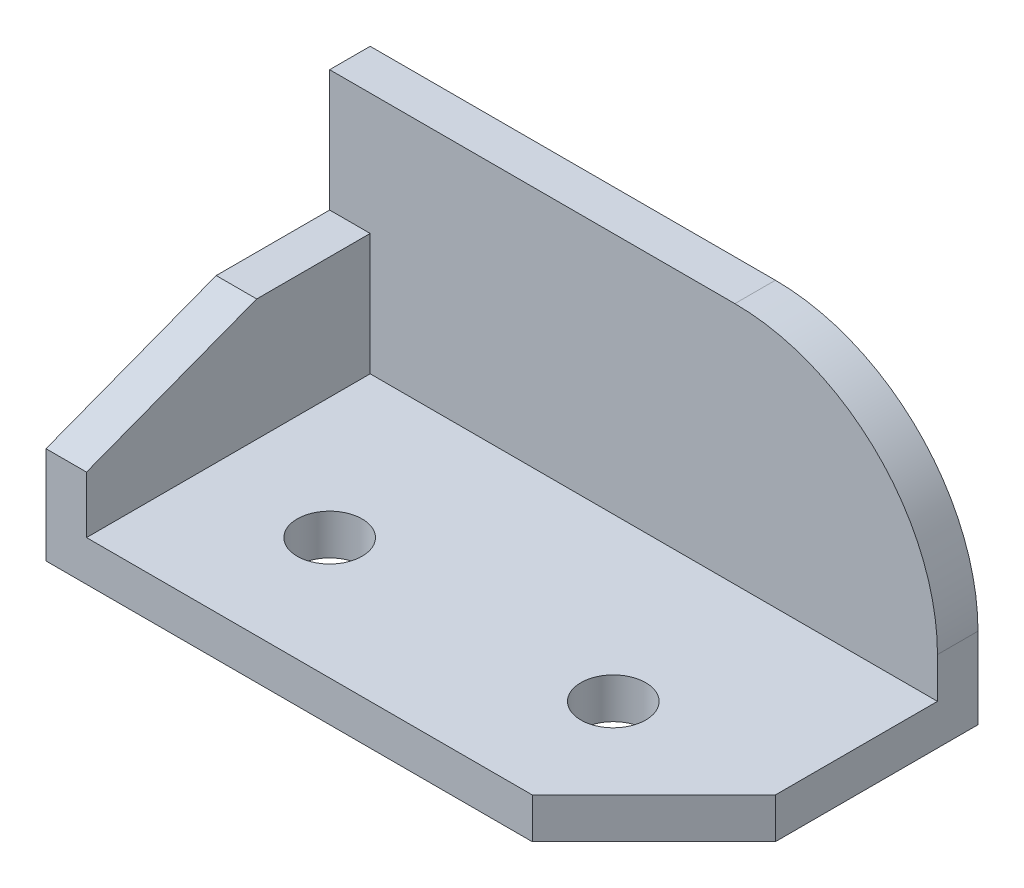
ISO-10303-21;
HEADER;
FILE_DESCRIPTION(('STEP AP214'),'2;1');
FILE_NAME('part.step','',(''),(''),'','','');
FILE_SCHEMA(('AUTOMOTIVE_DESIGN { 1 0 10303 214 1 1 1 1 }'));
ENDSEC;
DATA;
#1=APPLICATION_CONTEXT('core data for automotive mechanical design processes');
#2=APPLICATION_PROTOCOL_DEFINITION('international standard','automotive_design',2000,#1);
#3=PRODUCT_CONTEXT('',#1,'mechanical');
#4=PRODUCT('Part','Part','',(#3));
#5=PRODUCT_RELATED_PRODUCT_CATEGORY('part','',(#4));
#6=PRODUCT_DEFINITION_FORMATION('','',#4);
#7=PRODUCT_DEFINITION_CONTEXT('part definition',#1,'design');
#8=PRODUCT_DEFINITION('design','',#6,#7);
#9=PRODUCT_DEFINITION_SHAPE('','',#8);
#10=(LENGTH_UNIT() NAMED_UNIT(*) SI_UNIT(.MILLI.,.METRE.));
#11=(NAMED_UNIT(*) PLANE_ANGLE_UNIT() SI_UNIT($,.RADIAN.));
#12=(NAMED_UNIT(*) SI_UNIT($,.STERADIAN.) SOLID_ANGLE_UNIT());
#13=UNCERTAINTY_MEASURE_WITH_UNIT(LENGTH_MEASURE(1.E-05),#10,'distance_accuracy_value','');
#14=(GEOMETRIC_REPRESENTATION_CONTEXT(3) GLOBAL_UNCERTAINTY_ASSIGNED_CONTEXT((#13)) GLOBAL_UNIT_ASSIGNED_CONTEXT((#10,
#11,#12)) REPRESENTATION_CONTEXT('',''));
#15=CARTESIAN_POINT('',(0.,0.,0.));
#16=DIRECTION('',(0.,0.,1.));
#17=DIRECTION('',(1.,0.,0.));
#18=AXIS2_PLACEMENT_3D('',#15,#16,#17);
#19=CARTESIAN_POINT('',(0.,5.,40.));
#20=DIRECTION('',(0.,0.,-1.));
#21=DIRECTION('',(-1.,0.,0.));
#22=AXIS2_PLACEMENT_3D('',#19,#20,#21);
#23=PLANE('',#22);
#24=DIRECTION('',(0.,-1.,0.));
#25=VECTOR('',#24,1.);
#26=CARTESIAN_POINT('',(5.,20.,40.));
#27=LINE('',#26,#25);
#28=CARTESIAN_POINT('',(5.,12.,40.));
#29=VERTEX_POINT('',#28);
#30=CARTESIAN_POINT('',(5.,5.,40.));
#31=VERTEX_POINT('',#30);
#32=EDGE_CURVE('E147',#29,#31,#27,.T.);
#33=ORIENTED_EDGE('',*,*,#32,.F.);
#34=DIRECTION('',(-1.,0.,0.));
#35=VECTOR('',#34,1.);
#36=CARTESIAN_POINT('',(0.,12.,40.));
#37=LINE('',#36,#35);
#38=CARTESIAN_POINT('',(0.,12.,40.));
#39=VERTEX_POINT('',#38);
#40=EDGE_CURVE('E212',#29,#39,#37,.T.);
#41=ORIENTED_EDGE('',*,*,#40,.T.);
#42=DIRECTION('',(0.,-1.,0.));
#43=VECTOR('',#42,1.);
#44=CARTESIAN_POINT('',(0.,20.,40.));
#45=LINE('',#44,#43);
#46=CARTESIAN_POINT('',(0.,0.,40.));
#47=VERTEX_POINT('',#46);
#48=EDGE_CURVE('E142',#39,#47,#45,.T.);
#49=ORIENTED_EDGE('',*,*,#48,.T.);
#50=DIRECTION('',(1.,0.,0.));
#51=VECTOR('',#50,1.);
#52=CARTESIAN_POINT('',(0.,0.,40.));
#53=LINE('',#52,#51);
#54=CARTESIAN_POINT('',(60.,0.,40.));
#55=VERTEX_POINT('',#54);
#56=EDGE_CURVE('E200',#47,#55,#53,.T.);
#57=ORIENTED_EDGE('',*,*,#56,.T.);
#58=DIRECTION('',(0.,-1.,0.));
#59=VECTOR('',#58,1.);
#60=CARTESIAN_POINT('',(60.,5.,40.));
#61=LINE('',#60,#59);
#62=CARTESIAN_POINT('',(60.,5.,40.));
#63=VERTEX_POINT('',#62);
#64=EDGE_CURVE('E208',#63,#55,#61,.T.);
#65=ORIENTED_EDGE('',*,*,#64,.F.);
#66=DIRECTION('',(1.,0.,0.));
#67=VECTOR('',#66,1.);
#68=CARTESIAN_POINT('',(0.,5.,40.));
#69=LINE('',#68,#67);
#70=EDGE_CURVE('E185',#31,#63,#69,.T.);
#71=ORIENTED_EDGE('',*,*,#70,.F.);
#72=EDGE_LOOP('',(#33,#41,#49,#57,#65,#71));
#73=FACE_BOUND('',#72,.T.);
#74=ADVANCED_FACE('F41',(#73),#23,.F.);
#75=CARTESIAN_POINT('',(50.,5.,50.));
#76=DIRECTION('',(-0.707106781186548,0.,-0.707106781186548));
#77=DIRECTION('',(-0.707106781186548,0.,0.707106781186548));
#78=AXIS2_PLACEMENT_3D('',#75,#76,#77);
#79=PLANE('',#78);
#80=DIRECTION('',(0.707106781186548,0.,-0.707106781186548));
#81=VECTOR('',#80,1.);
#82=CARTESIAN_POINT('',(50.,0.,50.));
#83=LINE('',#82,#81);
#84=CARTESIAN_POINT('',(75.,0.,25.));
#85=VERTEX_POINT('',#84);
#86=EDGE_CURVE('E205',#55,#85,#83,.T.);
#87=ORIENTED_EDGE('',*,*,#86,.T.);
#88=DIRECTION('',(0.,-1.,0.));
#89=VECTOR('',#88,1.);
#90=CARTESIAN_POINT('',(75.,5.,25.));
#91=LINE('',#90,#89);
#92=CARTESIAN_POINT('',(75.,5.,25.));
#93=VERTEX_POINT('',#92);
#94=EDGE_CURVE('E195',#93,#85,#91,.T.);
#95=ORIENTED_EDGE('',*,*,#94,.F.);
#96=DIRECTION('',(0.707106781186548,0.,-0.707106781186548));
#97=VECTOR('',#96,1.);
#98=CARTESIAN_POINT('',(50.,5.,50.));
#99=LINE('',#98,#97);
#100=EDGE_CURVE('E183',#63,#93,#99,.T.);
#101=ORIENTED_EDGE('',*,*,#100,.F.);
#102=ORIENTED_EDGE('',*,*,#64,.T.);
#103=EDGE_LOOP('',(#87,#95,#101,#102));
#104=FACE_BOUND('',#103,.T.);
#105=ADVANCED_FACE('F235',(#104),#79,.F.);
#106=CARTESIAN_POINT('',(75.,5.,0.));
#107=DIRECTION('',(1.,0.,0.));
#108=DIRECTION('',(0.,0.,-1.));
#109=AXIS2_PLACEMENT_3D('',#106,#107,#108);
#110=PLANE('',#109);
#111=DIRECTION('',(0.,-1.,0.));
#112=VECTOR('',#111,1.);
#113=CARTESIAN_POINT('',(75.,35.,0.));
#114=LINE('',#113,#112);
#115=CARTESIAN_POINT('',(75.,10.,0.));
#116=VERTEX_POINT('',#115);
#117=CARTESIAN_POINT('',(75.,0.,0.));
#118=VERTEX_POINT('',#117);
#119=EDGE_CURVE('E168',#116,#118,#114,.T.);
#120=ORIENTED_EDGE('',*,*,#119,.F.);
#121=DIRECTION('',(0.,0.,1.));
#122=VECTOR('',#121,1.);
#123=CARTESIAN_POINT('',(75.,10.,0.));
#124=LINE('',#123,#122);
#125=CARTESIAN_POINT('',(75.,10.,5.));
#126=VERTEX_POINT('',#125);
#127=EDGE_CURVE('E217',#116,#126,#124,.T.);
#128=ORIENTED_EDGE('',*,*,#127,.T.);
#129=DIRECTION('',(0.,-1.,0.));
#130=VECTOR('',#129,1.);
#131=CARTESIAN_POINT('',(75.,35.,5.));
#132=LINE('',#131,#130);
#133=CARTESIAN_POINT('',(75.,5.,5.));
#134=VERTEX_POINT('',#133);
#135=EDGE_CURVE('E175',#126,#134,#132,.T.);
#136=ORIENTED_EDGE('',*,*,#135,.T.);
#137=DIRECTION('',(0.,0.,1.));
#138=VECTOR('',#137,1.);
#139=CARTESIAN_POINT('',(75.,5.,0.));
#140=LINE('',#139,#138);
#141=EDGE_CURVE('E190',#134,#93,#140,.T.);
#142=ORIENTED_EDGE('',*,*,#141,.T.);
#143=ORIENTED_EDGE('',*,*,#94,.T.);
#144=DIRECTION('',(0.,0.,1.));
#145=VECTOR('',#144,1.);
#146=CARTESIAN_POINT('',(75.,0.,0.));
#147=LINE('',#146,#145);
#148=EDGE_CURVE('E176',#118,#85,#147,.T.);
#149=ORIENTED_EDGE('',*,*,#148,.F.);
#150=EDGE_LOOP('',(#120,#128,#136,#142,#143,#149));
#151=FACE_BOUND('',#150,.T.);
#152=ADVANCED_FACE('F221',(#151),#110,.T.);
#153=CARTESIAN_POINT('',(55.,5.,25.));
#154=DIRECTION('',(0.,-1.,0.));
#155=DIRECTION('',(0.,0.,-1.));
#156=AXIS2_PLACEMENT_3D('',#153,#154,#155);
#157=CYLINDRICAL_SURFACE('',#156,4.);
#158=CARTESIAN_POINT('',(55.,5.,25.));
#159=DIRECTION('',(0.,1.,0.));
#160=DIRECTION('',(0.,0.,1.));
#161=AXIS2_PLACEMENT_3D('',#158,#159,#160);
#162=CIRCLE('',#161,4.);
#163=CARTESIAN_POINT('',(55.,5.,29.));
#164=VERTEX_POINT('',#163);
#165=EDGE_CURVE('E180',#164,#164,#162,.T.);
#166=ORIENTED_EDGE('',*,*,#165,.T.);
#167=EDGE_LOOP('',(#166));
#168=FACE_BOUND('',#167,.T.);
#169=CARTESIAN_POINT('',(55.,0.,25.));
#170=DIRECTION('',(0.,1.,0.));
#171=DIRECTION('',(0.,0.,1.));
#172=AXIS2_PLACEMENT_3D('',#169,#170,#171);
#173=CIRCLE('',#172,4.);
#174=CARTESIAN_POINT('',(55.,0.,29.));
#175=VERTEX_POINT('',#174);
#176=EDGE_CURVE('E198',#175,#175,#173,.T.);
#177=ORIENTED_EDGE('',*,*,#176,.F.);
#178=EDGE_LOOP('',(#177));
#179=FACE_BOUND('',#178,.T.);
#180=ADVANCED_FACE('F265',(#168,#179),#157,.F.);
#181=CARTESIAN_POINT('',(20.,5.,25.));
#182=DIRECTION('',(0.,-1.,0.));
#183=DIRECTION('',(0.,0.,-1.));
#184=AXIS2_PLACEMENT_3D('',#181,#182,#183);
#185=CYLINDRICAL_SURFACE('',#184,4.);
#186=CARTESIAN_POINT('',(20.,5.,25.));
#187=DIRECTION('',(0.,1.,0.));
#188=DIRECTION('',(0.,0.,1.));
#189=AXIS2_PLACEMENT_3D('',#186,#187,#188);
#190=CIRCLE('',#189,4.);
#191=CARTESIAN_POINT('',(20.,5.,29.));
#192=VERTEX_POINT('',#191);
#193=EDGE_CURVE('E173',#192,#192,#190,.T.);
#194=ORIENTED_EDGE('',*,*,#193,.T.);
#195=EDGE_LOOP('',(#194));
#196=FACE_BOUND('',#195,.T.);
#197=CARTESIAN_POINT('',(20.,0.,25.));
#198=DIRECTION('',(0.,1.,0.));
#199=DIRECTION('',(0.,0.,1.));
#200=AXIS2_PLACEMENT_3D('',#197,#198,#199);
#201=CIRCLE('',#200,4.);
#202=CARTESIAN_POINT('',(20.,0.,29.));
#203=VERTEX_POINT('',#202);
#204=EDGE_CURVE('E171',#203,#203,#201,.T.);
#205=ORIENTED_EDGE('',*,*,#204,.F.);
#206=EDGE_LOOP('',(#205));
#207=FACE_BOUND('',#206,.T.);
#208=ADVANCED_FACE('F264',(#196,#207),#185,.F.);
#209=CARTESIAN_POINT('',(0.,5.,0.));
#210=DIRECTION('',(0.,1.,0.));
#211=DIRECTION('',(0.,0.,1.));
#212=AXIS2_PLACEMENT_3D('',#209,#210,#211);
#213=PLANE('',#212);
#214=ORIENTED_EDGE('',*,*,#193,.F.);
#215=EDGE_LOOP('',(#214));
#216=FACE_BOUND('',#215,.T.);
#217=ORIENTED_EDGE('',*,*,#165,.F.);
#218=EDGE_LOOP('',(#217));
#219=FACE_BOUND('',#218,.T.);
#220=ORIENTED_EDGE('',*,*,#70,.T.);
#221=ORIENTED_EDGE('',*,*,#100,.T.);
#222=ORIENTED_EDGE('',*,*,#141,.F.);
#223=DIRECTION('',(-1.,0.,0.));
#224=VECTOR('',#223,1.);
#225=CARTESIAN_POINT('',(0.,5.,5.00000000000001));
#226=LINE('',#225,#224);
#227=CARTESIAN_POINT('',(5.,5.,5.00000000000001));
#228=VERTEX_POINT('',#227);
#229=EDGE_CURVE('E188',#134,#228,#226,.T.);
#230=ORIENTED_EDGE('',*,*,#229,.T.);
#231=DIRECTION('',(0.,0.,-1.));
#232=VECTOR('',#231,1.);
#233=CARTESIAN_POINT('',(5.00000000000001,5.,0.));
#234=LINE('',#233,#232);
#235=EDGE_CURVE('E140',#31,#228,#234,.T.);
#236=ORIENTED_EDGE('',*,*,#235,.F.);
#237=EDGE_LOOP('',(#220,#221,#222,#230,#236));
#238=FACE_BOUND('',#237,.T.);
#239=ADVANCED_FACE('F228',(#216,#219,#238),#213,.T.);
#240=CARTESIAN_POINT('',(0.,0.,0.));
#241=DIRECTION('',(0.,1.,0.));
#242=DIRECTION('',(0.,0.,1.));
#243=AXIS2_PLACEMENT_3D('',#240,#241,#242);
#244=PLANE('',#243);
#245=ORIENTED_EDGE('',*,*,#204,.T.);
#246=EDGE_LOOP('',(#245));
#247=FACE_BOUND('',#246,.T.);
#248=ORIENTED_EDGE('',*,*,#176,.T.);
#249=EDGE_LOOP('',(#248));
#250=FACE_BOUND('',#249,.T.);
#251=ORIENTED_EDGE('',*,*,#56,.F.);
#252=DIRECTION('',(0.,0.,1.));
#253=VECTOR('',#252,1.);
#254=CARTESIAN_POINT('',(0.,0.,0.));
#255=LINE('',#254,#253);
#256=CARTESIAN_POINT('',(0.,0.,0.));
#257=VERTEX_POINT('',#256);
#258=EDGE_CURVE('E158',#257,#47,#255,.T.);
#259=ORIENTED_EDGE('',*,*,#258,.F.);
#260=DIRECTION('',(1.,0.,0.));
#261=VECTOR('',#260,1.);
#262=CARTESIAN_POINT('',(0.,0.,0.));
#263=LINE('',#262,#261);
#264=EDGE_CURVE('E143',#257,#118,#263,.T.);
#265=ORIENTED_EDGE('',*,*,#264,.T.);
#266=ORIENTED_EDGE('',*,*,#148,.T.);
#267=ORIENTED_EDGE('',*,*,#86,.F.);
#268=EDGE_LOOP('',(#251,#259,#265,#266,#267));
#269=FACE_BOUND('',#268,.T.);
#270=ADVANCED_FACE('F240',(#247,#250,#269),#244,.F.);
#271=CARTESIAN_POINT('',(0.,35.,5.00000000000001));
#272=DIRECTION('',(0.,0.,1.));
#273=DIRECTION('',(1.,0.,0.));
#274=AXIS2_PLACEMENT_3D('',#271,#272,#273);
#275=PLANE('',#274);
#276=ORIENTED_EDGE('',*,*,#135,.F.);
#277=CARTESIAN_POINT('',(50.,10.,5.00000000000001));
#278=DIRECTION('',(0.,0.,1.));
#279=DIRECTION('',(1.,0.,0.));
#280=AXIS2_PLACEMENT_3D('',#277,#278,#279);
#281=CIRCLE('',#280,25.);
#282=CARTESIAN_POINT('',(50.,35.,5.00000000000001));
#283=VERTEX_POINT('',#282);
#284=EDGE_CURVE('E64',#126,#283,#281,.T.);
#285=ORIENTED_EDGE('',*,*,#284,.T.);
#286=DIRECTION('',(-1.,0.,0.));
#287=VECTOR('',#286,1.);
#288=CARTESIAN_POINT('',(0.,35.,5.00000000000001));
#289=LINE('',#288,#287);
#290=CARTESIAN_POINT('',(0.,35.,5.00000000000001));
#291=VERTEX_POINT('',#290);
#292=EDGE_CURVE('E154',#283,#291,#289,.T.);
#293=ORIENTED_EDGE('',*,*,#292,.T.);
#294=DIRECTION('',(0.,-1.,0.));
#295=VECTOR('',#294,1.);
#296=CARTESIAN_POINT('',(0.,35.,5.00000000000001));
#297=LINE('',#296,#295);
#298=CARTESIAN_POINT('',(0.,20.,5.00000000000001));
#299=VERTEX_POINT('',#298);
#300=EDGE_CURVE('E150',#291,#299,#297,.T.);
#301=ORIENTED_EDGE('',*,*,#300,.T.);
#302=DIRECTION('',(-1.,0.,0.));
#303=VECTOR('',#302,1.);
#304=CARTESIAN_POINT('',(0.,20.,5.00000000000001));
#305=LINE('',#304,#303);
#306=CARTESIAN_POINT('',(5.,20.,5.00000000000001));
#307=VERTEX_POINT('',#306);
#308=EDGE_CURVE('E126',#307,#299,#305,.T.);
#309=ORIENTED_EDGE('',*,*,#308,.F.);
#310=DIRECTION('',(0.,-1.,0.));
#311=VECTOR('',#310,1.);
#312=CARTESIAN_POINT('',(5.,20.,5.00000000000001));
#313=LINE('',#312,#311);
#314=EDGE_CURVE('E133',#307,#228,#313,.T.);
#315=ORIENTED_EDGE('',*,*,#314,.T.);
#316=ORIENTED_EDGE('',*,*,#229,.F.);
#317=EDGE_LOOP('',(#276,#285,#293,#301,#309,#315,#316));
#318=FACE_BOUND('',#317,.T.);
#319=ADVANCED_FACE('F144',(#318),#275,.T.);
#320=CARTESIAN_POINT('',(0.,35.,0.));
#321=DIRECTION('',(0.,0.,-1.));
#322=DIRECTION('',(-1.,0.,0.));
#323=AXIS2_PLACEMENT_3D('',#320,#321,#322);
#324=PLANE('',#323);
#325=DIRECTION('',(1.,0.,0.));
#326=VECTOR('',#325,1.);
#327=CARTESIAN_POINT('',(0.,35.,0.));
#328=LINE('',#327,#326);
#329=CARTESIAN_POINT('',(0.,35.,0.));
#330=VERTEX_POINT('',#329);
#331=CARTESIAN_POINT('',(50.,35.,0.));
#332=VERTEX_POINT('',#331);
#333=EDGE_CURVE('E160',#330,#332,#328,.T.);
#334=ORIENTED_EDGE('',*,*,#333,.T.);
#335=CARTESIAN_POINT('',(50.,10.,0.));
#336=DIRECTION('',(0.,0.,-1.));
#337=DIRECTION('',(-1.,0.,0.));
#338=AXIS2_PLACEMENT_3D('',#335,#336,#337);
#339=CIRCLE('',#338,25.);
#340=EDGE_CURVE('E11',#332,#116,#339,.T.);
#341=ORIENTED_EDGE('',*,*,#340,.T.);
#342=ORIENTED_EDGE('',*,*,#119,.T.);
#343=ORIENTED_EDGE('',*,*,#264,.F.);
#344=DIRECTION('',(0.,-1.,0.));
#345=VECTOR('',#344,1.);
#346=CARTESIAN_POINT('',(0.,35.,0.));
#347=LINE('',#346,#345);
#348=EDGE_CURVE('E169',#330,#257,#347,.T.);
#349=ORIENTED_EDGE('',*,*,#348,.F.);
#350=EDGE_LOOP('',(#334,#341,#342,#343,#349));
#351=FACE_BOUND('',#350,.T.);
#352=ADVANCED_FACE('F242',(#351),#324,.T.);
#353=CARTESIAN_POINT('',(0.,35.,0.));
#354=DIRECTION('',(1.,0.,0.));
#355=DIRECTION('',(0.,0.,-1.));
#356=AXIS2_PLACEMENT_3D('',#353,#354,#355);
#357=PLANE('',#356);
#358=ORIENTED_EDGE('',*,*,#48,.F.);
#359=DIRECTION('',(0.,0.355995327591985,-0.934487734928969));
#360=VECTOR('',#359,1.);
#361=CARTESIAN_POINT('',(0.,20.,18.9999999999998));
#362=LINE('',#361,#360);
#363=CARTESIAN_POINT('',(0.,20.,18.9999999999998));
#364=VERTEX_POINT('',#363);
#365=EDGE_CURVE('E216',#39,#364,#362,.T.);
#366=ORIENTED_EDGE('',*,*,#365,.T.);
#367=DIRECTION('',(0.,0.,1.));
#368=VECTOR('',#367,1.);
#369=CARTESIAN_POINT('',(0.,20.,0.));
#370=LINE('',#369,#368);
#371=EDGE_CURVE('E146',#299,#364,#370,.T.);
#372=ORIENTED_EDGE('',*,*,#371,.F.);
#373=ORIENTED_EDGE('',*,*,#300,.F.);
#374=DIRECTION('',(0.,0.,1.));
#375=VECTOR('',#374,1.);
#376=CARTESIAN_POINT('',(0.,35.,0.));
#377=LINE('',#376,#375);
#378=EDGE_CURVE('E159',#330,#291,#377,.T.);
#379=ORIENTED_EDGE('',*,*,#378,.F.);
#380=ORIENTED_EDGE('',*,*,#348,.T.);
#381=ORIENTED_EDGE('',*,*,#258,.T.);
#382=EDGE_LOOP('',(#358,#366,#372,#373,#379,#380,#381));
#383=FACE_BOUND('',#382,.T.);
#384=ADVANCED_FACE('F306',(#383),#357,.F.);
#385=CARTESIAN_POINT('',(0.,35.,0.));
#386=DIRECTION('',(0.,1.,0.));
#387=DIRECTION('',(0.,0.,1.));
#388=AXIS2_PLACEMENT_3D('',#385,#386,#387);
#389=PLANE('',#388);
#390=ORIENTED_EDGE('',*,*,#292,.F.);
#391=DIRECTION('',(0.,0.,1.));
#392=VECTOR('',#391,1.);
#393=CARTESIAN_POINT('',(50.,35.,0.));
#394=LINE('',#393,#392);
#395=EDGE_CURVE('E47',#283,#332,#394,.F.);
#396=ORIENTED_EDGE('',*,*,#395,.T.);
#397=ORIENTED_EDGE('',*,*,#333,.F.);
#398=ORIENTED_EDGE('',*,*,#378,.T.);
#399=EDGE_LOOP('',(#390,#396,#397,#398));
#400=FACE_BOUND('',#399,.T.);
#401=ADVANCED_FACE('F314',(#400),#389,.T.);
#402=CARTESIAN_POINT('',(5.00000000000001,20.,0.));
#403=DIRECTION('',(-1.,0.,0.));
#404=DIRECTION('',(0.,0.,1.));
#405=AXIS2_PLACEMENT_3D('',#402,#403,#404);
#406=PLANE('',#405);
#407=DIRECTION('',(0.,0.,-1.));
#408=VECTOR('',#407,1.);
#409=CARTESIAN_POINT('',(5.00000000000001,20.,0.));
#410=LINE('',#409,#408);
#411=CARTESIAN_POINT('',(5.,20.,18.9999999999998));
#412=VERTEX_POINT('',#411);
#413=EDGE_CURVE('E125',#412,#307,#410,.T.);
#414=ORIENTED_EDGE('',*,*,#413,.F.);
#415=DIRECTION('',(0.,-0.355995327591985,0.934487734928969));
#416=VECTOR('',#415,1.);
#417=CARTESIAN_POINT('',(5.,20.,18.9999999999998));
#418=LINE('',#417,#416);
#419=EDGE_CURVE('E215',#412,#29,#418,.T.);
#420=ORIENTED_EDGE('',*,*,#419,.T.);
#421=ORIENTED_EDGE('',*,*,#32,.T.);
#422=ORIENTED_EDGE('',*,*,#235,.T.);
#423=ORIENTED_EDGE('',*,*,#314,.F.);
#424=EDGE_LOOP('',(#414,#420,#421,#422,#423));
#425=FACE_BOUND('',#424,.T.);
#426=ADVANCED_FACE('F137',(#425),#406,.F.);
#427=CARTESIAN_POINT('',(0.,20.,0.));
#428=DIRECTION('',(0.,1.,0.));
#429=DIRECTION('',(0.,0.,1.));
#430=AXIS2_PLACEMENT_3D('',#427,#428,#429);
#431=PLANE('',#430);
#432=ORIENTED_EDGE('',*,*,#371,.T.);
#433=DIRECTION('',(1.,0.,0.));
#434=VECTOR('',#433,1.);
#435=CARTESIAN_POINT('',(5.,20.,18.9999999999998));
#436=LINE('',#435,#434);
#437=EDGE_CURVE('E132',#364,#412,#436,.T.);
#438=ORIENTED_EDGE('',*,*,#437,.T.);
#439=ORIENTED_EDGE('',*,*,#413,.T.);
#440=ORIENTED_EDGE('',*,*,#308,.T.);
#441=EDGE_LOOP('',(#432,#438,#439,#440));
#442=FACE_BOUND('',#441,.T.);
#443=ADVANCED_FACE('F127',(#442),#431,.T.);
#444=CARTESIAN_POINT('',(0.,20.,18.9999999999998));
#445=DIRECTION('',(0.,0.934487734928969,0.355995327591985));
#446=DIRECTION('',(-1.,0.,0.));
#447=AXIS2_PLACEMENT_3D('',#444,#445,#446);
#448=PLANE('',#447);
#449=ORIENTED_EDGE('',*,*,#365,.F.);
#450=ORIENTED_EDGE('',*,*,#40,.F.);
#451=ORIENTED_EDGE('',*,*,#419,.F.);
#452=ORIENTED_EDGE('',*,*,#437,.F.);
#453=EDGE_LOOP('',(#449,#450,#451,#452));
#454=FACE_BOUND('',#453,.T.);
#455=ADVANCED_FACE('F241',(#454),#448,.T.);
#456=CARTESIAN_POINT('',(50.,10.,0.));
#457=DIRECTION('',(0.,0.,1.));
#458=DIRECTION('',(1.,0.,0.));
#459=AXIS2_PLACEMENT_3D('',#456,#457,#458);
#460=CYLINDRICAL_SURFACE('',#459,25.);
#461=ORIENTED_EDGE('',*,*,#340,.F.);
#462=ORIENTED_EDGE('',*,*,#395,.F.);
#463=ORIENTED_EDGE('',*,*,#284,.F.);
#464=ORIENTED_EDGE('',*,*,#127,.F.);
#465=EDGE_LOOP('',(#461,#462,#463,#464));
#466=FACE_BOUND('',#465,.T.);
#467=ADVANCED_FACE('F43',(#466),#460,.T.);
#468=CLOSED_SHELL('',(#74,#105,#152,#180,#208,#239,#270,#319,#352,#384,#401,#426,#443,#455,#467));
#469=MANIFOLD_SOLID_BREP('B2',#468);
#470=ADVANCED_BREP_SHAPE_REPRESENTATION('',(#18,#469),#14);
#471=SHAPE_DEFINITION_REPRESENTATION(#9,#470);
ENDSEC;
END-ISO-10303-21;
